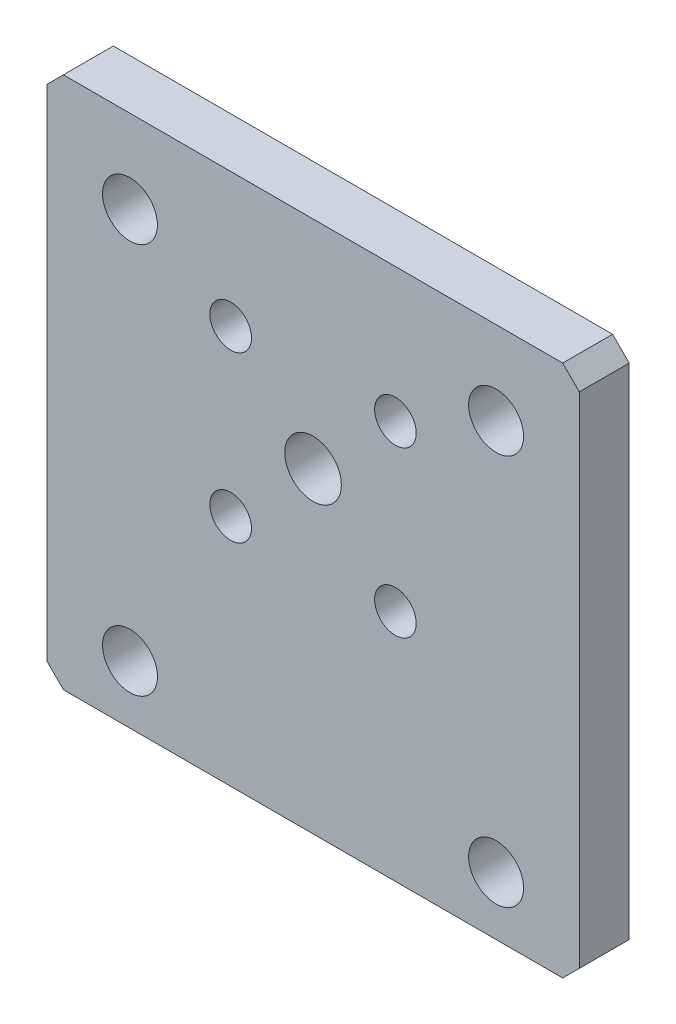
ISO-10303-21;
HEADER;
FILE_DESCRIPTION(('STEP AP214'),'2;1');
FILE_NAME('part.step','',(''),(''),'','','');
FILE_SCHEMA(('AUTOMOTIVE_DESIGN { 1 0 10303 214 1 1 1 1 }'));
ENDSEC;
DATA;
#1=APPLICATION_CONTEXT('core data for automotive mechanical design processes');
#2=APPLICATION_PROTOCOL_DEFINITION('international standard','automotive_design',2000,#1);
#3=PRODUCT_CONTEXT('',#1,'mechanical');
#4=PRODUCT('Part','Part','',(#3));
#5=PRODUCT_RELATED_PRODUCT_CATEGORY('part','',(#4));
#6=PRODUCT_DEFINITION_FORMATION('','',#4);
#7=PRODUCT_DEFINITION_CONTEXT('part definition',#1,'design');
#8=PRODUCT_DEFINITION('design','',#6,#7);
#9=PRODUCT_DEFINITION_SHAPE('','',#8);
#10=(LENGTH_UNIT() NAMED_UNIT(*) SI_UNIT(.MILLI.,.METRE.));
#11=(NAMED_UNIT(*) PLANE_ANGLE_UNIT() SI_UNIT($,.RADIAN.));
#12=(NAMED_UNIT(*) SI_UNIT($,.STERADIAN.) SOLID_ANGLE_UNIT());
#13=UNCERTAINTY_MEASURE_WITH_UNIT(LENGTH_MEASURE(1.E-05),#10,'distance_accuracy_value','');
#14=(GEOMETRIC_REPRESENTATION_CONTEXT(3) GLOBAL_UNCERTAINTY_ASSIGNED_CONTEXT((#13)) GLOBAL_UNIT_ASSIGNED_CONTEXT((#10,
#11,#12)) REPRESENTATION_CONTEXT('',''));
#15=CARTESIAN_POINT('',(0.,0.,0.));
#16=DIRECTION('',(0.,0.,1.));
#17=DIRECTION('',(1.,0.,0.));
#18=AXIS2_PLACEMENT_3D('',#15,#16,#17);
#19=CARTESIAN_POINT('',(0.,0.,3.));
#20=DIRECTION('',(0.,0.,-1.));
#21=DIRECTION('',(-1.,0.,0.));
#22=AXIS2_PLACEMENT_3D('',#19,#20,#21);
#23=PLANE('',#22);
#24=CARTESIAN_POINT('',(11.,8.,3.));
#25=DIRECTION('',(0.,0.,1.));
#26=DIRECTION('',(1.,0.,0.));
#27=AXIS2_PLACEMENT_3D('',#24,#25,#26);
#28=CIRCLE('',#27,1.64999999999999);
#29=CARTESIAN_POINT('',(12.65,8.,3.));
#30=VERTEX_POINT('',#29);
#31=EDGE_CURVE('E225',#30,#30,#28,.T.);
#32=ORIENTED_EDGE('',*,*,#31,.F.);
#33=EDGE_LOOP('',(#32));
#34=FACE_BOUND('',#33,.T.);
#35=CARTESIAN_POINT('',(11.,-15.5,3.));
#36=DIRECTION('',(0.,0.,1.));
#37=DIRECTION('',(1.,0.,0.));
#38=AXIS2_PLACEMENT_3D('',#35,#36,#37);
#39=CIRCLE('',#38,1.64999999999999);
#40=CARTESIAN_POINT('',(12.65,-15.5,3.));
#41=VERTEX_POINT('',#40);
#42=EDGE_CURVE('E213',#41,#41,#39,.T.);
#43=ORIENTED_EDGE('',*,*,#42,.F.);
#44=EDGE_LOOP('',(#43));
#45=FACE_BOUND('',#44,.T.);
#46=CARTESIAN_POINT('',(-4.94974746830586,4.94974746830581,3.));
#47=DIRECTION('',(0.,0.,1.));
#48=DIRECTION('',(1.,0.,0.));
#49=AXIS2_PLACEMENT_3D('',#46,#47,#48);
#50=CIRCLE('',#49,1.25);
#51=CARTESIAN_POINT('',(-3.69974746830586,4.94974746830581,3.));
#52=VERTEX_POINT('',#51);
#53=EDGE_CURVE('E155',#52,#52,#50,.T.);
#54=ORIENTED_EDGE('',*,*,#53,.F.);
#55=EDGE_LOOP('',(#54));
#56=FACE_BOUND('',#55,.T.);
#57=CARTESIAN_POINT('',(4.94974746830586,4.94974746830581,3.));
#58=DIRECTION('',(0.,0.,1.));
#59=DIRECTION('',(1.,0.,0.));
#60=AXIS2_PLACEMENT_3D('',#57,#58,#59);
#61=CIRCLE('',#60,1.25);
#62=CARTESIAN_POINT('',(6.19974746830586,4.94974746830581,3.));
#63=VERTEX_POINT('',#62);
#64=EDGE_CURVE('E154',#63,#63,#61,.T.);
#65=ORIENTED_EDGE('',*,*,#64,.F.);
#66=EDGE_LOOP('',(#65));
#67=FACE_BOUND('',#66,.T.);
#68=CARTESIAN_POINT('',(4.94974746830582,-4.94974746830584,3.));
#69=DIRECTION('',(0.,0.,1.));
#70=DIRECTION('',(1.,0.,0.));
#71=AXIS2_PLACEMENT_3D('',#68,#69,#70);
#72=CIRCLE('',#71,1.25);
#73=CARTESIAN_POINT('',(6.19974746830582,-4.94974746830584,3.));
#74=VERTEX_POINT('',#73);
#75=EDGE_CURVE('E150',#74,#74,#72,.T.);
#76=ORIENTED_EDGE('',*,*,#75,.F.);
#77=EDGE_LOOP('',(#76));
#78=FACE_BOUND('',#77,.T.);
#79=CARTESIAN_POINT('',(-4.94974746830586,-4.94974746830581,3.));
#80=DIRECTION('',(0.,0.,1.));
#81=DIRECTION('',(1.,0.,0.));
#82=AXIS2_PLACEMENT_3D('',#79,#80,#81);
#83=CIRCLE('',#82,1.25);
#84=CARTESIAN_POINT('',(-3.69974746830586,-4.94974746830581,3.));
#85=VERTEX_POINT('',#84);
#86=EDGE_CURVE('E146',#85,#85,#83,.T.);
#87=ORIENTED_EDGE('',*,*,#86,.F.);
#88=EDGE_LOOP('',(#87));
#89=FACE_BOUND('',#88,.T.);
#90=CARTESIAN_POINT('',(0.,0.,3.));
#91=DIRECTION('',(0.,0.,1.));
#92=DIRECTION('',(1.,0.,0.));
#93=AXIS2_PLACEMENT_3D('',#90,#91,#92);
#94=CIRCLE('',#93,1.7);
#95=CARTESIAN_POINT('',(1.7,0.,3.));
#96=VERTEX_POINT('',#95);
#97=EDGE_CURVE('E145',#96,#96,#94,.T.);
#98=ORIENTED_EDGE('',*,*,#97,.F.);
#99=EDGE_LOOP('',(#98));
#100=FACE_BOUND('',#99,.T.);
#101=DIRECTION('',(0.,-1.,0.));
#102=VECTOR('',#101,1.);
#103=CARTESIAN_POINT('',(-16.,13.,3.));
#104=LINE('',#103,#102);
#105=CARTESIAN_POINT('',(-16.,12.,3.));
#106=VERTEX_POINT('',#105);
#107=CARTESIAN_POINT('',(-16.,-17.9999999999999,3.));
#108=VERTEX_POINT('',#107);
#109=EDGE_CURVE('E141',#106,#108,#104,.T.);
#110=ORIENTED_EDGE('',*,*,#109,.T.);
#111=DIRECTION('',(-0.707106781186545,0.70710678118655,0.));
#112=VECTOR('',#111,1.);
#113=CARTESIAN_POINT('',(-15.,-19.,3.));
#114=LINE('',#113,#112);
#115=CARTESIAN_POINT('',(-15.,-19.,3.));
#116=VERTEX_POINT('',#115);
#117=EDGE_CURVE('E170',#108,#116,#114,.F.);
#118=ORIENTED_EDGE('',*,*,#117,.T.);
#119=DIRECTION('',(1.,0.,0.));
#120=VECTOR('',#119,1.);
#121=CARTESIAN_POINT('',(16.,-19.,3.));
#122=LINE('',#121,#120);
#123=CARTESIAN_POINT('',(15.,-19.,3.));
#124=VERTEX_POINT('',#123);
#125=EDGE_CURVE('E124',#116,#124,#122,.T.);
#126=ORIENTED_EDGE('',*,*,#125,.T.);
#127=DIRECTION('',(-0.707106781186548,-0.707106781186548,0.));
#128=VECTOR('',#127,1.);
#129=CARTESIAN_POINT('',(16.,-18.,3.));
#130=LINE('',#129,#128);
#131=CARTESIAN_POINT('',(16.,-18.,3.));
#132=VERTEX_POINT('',#131);
#133=EDGE_CURVE('E168',#124,#132,#130,.F.);
#134=ORIENTED_EDGE('',*,*,#133,.T.);
#135=DIRECTION('',(0.,1.,0.));
#136=VECTOR('',#135,1.);
#137=CARTESIAN_POINT('',(16.,13.,3.));
#138=LINE('',#137,#136);
#139=CARTESIAN_POINT('',(16.,12.,3.));
#140=VERTEX_POINT('',#139);
#141=EDGE_CURVE('E181',#132,#140,#138,.T.);
#142=ORIENTED_EDGE('',*,*,#141,.T.);
#143=DIRECTION('',(0.707106781186548,-0.707106781186548,0.));
#144=VECTOR('',#143,1.);
#145=CARTESIAN_POINT('',(15.,13.,3.));
#146=LINE('',#145,#144);
#147=CARTESIAN_POINT('',(15.,13.,3.));
#148=VERTEX_POINT('',#147);
#149=EDGE_CURVE('E59',#140,#148,#146,.F.);
#150=ORIENTED_EDGE('',*,*,#149,.T.);
#151=DIRECTION('',(-1.,0.,0.));
#152=VECTOR('',#151,1.);
#153=CARTESIAN_POINT('',(16.,13.,3.));
#154=LINE('',#153,#152);
#155=CARTESIAN_POINT('',(-15.,13.,3.));
#156=VERTEX_POINT('',#155);
#157=EDGE_CURVE('E156',#148,#156,#154,.T.);
#158=ORIENTED_EDGE('',*,*,#157,.T.);
#159=DIRECTION('',(0.70710678118655,0.707106781186545,0.));
#160=VECTOR('',#159,1.);
#161=CARTESIAN_POINT('',(-16.,12.,3.));
#162=LINE('',#161,#160);
#163=EDGE_CURVE('E165',#156,#106,#162,.F.);
#164=ORIENTED_EDGE('',*,*,#163,.T.);
#165=EDGE_LOOP('',(#110,#118,#126,#134,#142,#150,#158,#164));
#166=FACE_BOUND('',#165,.T.);
#167=CARTESIAN_POINT('',(-11.,-15.5,3.));
#168=DIRECTION('',(0.,0.,1.));
#169=DIRECTION('',(1.,0.,0.));
#170=AXIS2_PLACEMENT_3D('',#167,#168,#169);
#171=CIRCLE('',#170,1.64999999999999);
#172=CARTESIAN_POINT('',(-9.35000000000001,-15.5,3.));
#173=VERTEX_POINT('',#172);
#174=EDGE_CURVE('E219',#173,#173,#171,.T.);
#175=ORIENTED_EDGE('',*,*,#174,.F.);
#176=EDGE_LOOP('',(#175));
#177=FACE_BOUND('',#176,.T.);
#178=CARTESIAN_POINT('',(-11.,8.,3.));
#179=DIRECTION('',(0.,0.,1.));
#180=DIRECTION('',(1.,0.,0.));
#181=AXIS2_PLACEMENT_3D('',#178,#179,#180);
#182=CIRCLE('',#181,1.64999999999999);
#183=CARTESIAN_POINT('',(-9.35000000000001,8.,3.));
#184=VERTEX_POINT('',#183);
#185=EDGE_CURVE('E231',#184,#184,#182,.T.);
#186=ORIENTED_EDGE('',*,*,#185,.F.);
#187=EDGE_LOOP('',(#186));
#188=FACE_BOUND('',#187,.T.);
#189=ADVANCED_FACE('F38',(#34,#45,#56,#67,#78,#89,#100,#166,#177,#188),#23,.F.);
#190=CARTESIAN_POINT('',(-16.,13.,3.));
#191=DIRECTION('',(1.,0.,0.));
#192=DIRECTION('',(0.,1.,0.));
#193=AXIS2_PLACEMENT_3D('',#190,#191,#192);
#194=PLANE('',#193);
#195=DIRECTION('',(0.,-1.,0.));
#196=VECTOR('',#195,1.);
#197=CARTESIAN_POINT('',(-16.,13.,0.));
#198=LINE('',#197,#196);
#199=CARTESIAN_POINT('',(-16.,12.,0.));
#200=VERTEX_POINT('',#199);
#201=CARTESIAN_POINT('',(-16.,-17.9999999999999,0.));
#202=VERTEX_POINT('',#201);
#203=EDGE_CURVE('E131',#200,#202,#198,.T.);
#204=ORIENTED_EDGE('',*,*,#203,.T.);
#205=DIRECTION('',(0.,0.,1.));
#206=VECTOR('',#205,1.);
#207=CARTESIAN_POINT('',(-16.,-17.9999999999999,3.));
#208=LINE('',#207,#206);
#209=EDGE_CURVE('E109',#202,#108,#208,.T.);
#210=ORIENTED_EDGE('',*,*,#209,.T.);
#211=ORIENTED_EDGE('',*,*,#109,.F.);
#212=DIRECTION('',(0.,0.,-1.));
#213=VECTOR('',#212,1.);
#214=CARTESIAN_POINT('',(-16.,12.,3.));
#215=LINE('',#214,#213);
#216=EDGE_CURVE('E114',#106,#200,#215,.T.);
#217=ORIENTED_EDGE('',*,*,#216,.T.);
#218=EDGE_LOOP('',(#204,#210,#211,#217));
#219=FACE_BOUND('',#218,.T.);
#220=ADVANCED_FACE('F239',(#219),#194,.F.);
#221=CARTESIAN_POINT('',(16.,-19.,3.));
#222=DIRECTION('',(0.,1.,0.));
#223=DIRECTION('',(-1.,0.,0.));
#224=AXIS2_PLACEMENT_3D('',#221,#222,#223);
#225=PLANE('',#224);
#226=ORIENTED_EDGE('',*,*,#125,.F.);
#227=DIRECTION('',(0.,0.,-1.));
#228=VECTOR('',#227,1.);
#229=CARTESIAN_POINT('',(-15.,-19.,3.));
#230=LINE('',#229,#228);
#231=CARTESIAN_POINT('',(-15.,-19.,0.));
#232=VERTEX_POINT('',#231);
#233=EDGE_CURVE('E108',#116,#232,#230,.T.);
#234=ORIENTED_EDGE('',*,*,#233,.T.);
#235=DIRECTION('',(1.,0.,0.));
#236=VECTOR('',#235,1.);
#237=CARTESIAN_POINT('',(16.,-19.,0.));
#238=LINE('',#237,#236);
#239=CARTESIAN_POINT('',(15.,-19.,0.));
#240=VERTEX_POINT('',#239);
#241=EDGE_CURVE('E121',#232,#240,#238,.T.);
#242=ORIENTED_EDGE('',*,*,#241,.T.);
#243=DIRECTION('',(0.,0.,1.));
#244=VECTOR('',#243,1.);
#245=CARTESIAN_POINT('',(15.,-19.,3.));
#246=LINE('',#245,#244);
#247=EDGE_CURVE('E126',#240,#124,#246,.T.);
#248=ORIENTED_EDGE('',*,*,#247,.T.);
#249=EDGE_LOOP('',(#226,#234,#242,#248));
#250=FACE_BOUND('',#249,.T.);
#251=ADVANCED_FACE('F120',(#250),#225,.F.);
#252=CARTESIAN_POINT('',(16.,13.,3.));
#253=DIRECTION('',(-1.,0.,0.));
#254=DIRECTION('',(0.,-1.,0.));
#255=AXIS2_PLACEMENT_3D('',#252,#253,#254);
#256=PLANE('',#255);
#257=ORIENTED_EDGE('',*,*,#141,.F.);
#258=DIRECTION('',(0.,0.,-1.));
#259=VECTOR('',#258,1.);
#260=CARTESIAN_POINT('',(16.,-18.,3.));
#261=LINE('',#260,#259);
#262=CARTESIAN_POINT('',(16.,-18.,0.));
#263=VERTEX_POINT('',#262);
#264=EDGE_CURVE('E174',#132,#263,#261,.T.);
#265=ORIENTED_EDGE('',*,*,#264,.T.);
#266=DIRECTION('',(0.,1.,0.));
#267=VECTOR('',#266,1.);
#268=CARTESIAN_POINT('',(16.,13.,0.));
#269=LINE('',#268,#267);
#270=CARTESIAN_POINT('',(16.,12.,0.));
#271=VERTEX_POINT('',#270);
#272=EDGE_CURVE('E130',#263,#271,#269,.T.);
#273=ORIENTED_EDGE('',*,*,#272,.T.);
#274=DIRECTION('',(0.,0.,1.));
#275=VECTOR('',#274,1.);
#276=CARTESIAN_POINT('',(16.,12.,3.));
#277=LINE('',#276,#275);
#278=EDGE_CURVE('E172',#271,#140,#277,.T.);
#279=ORIENTED_EDGE('',*,*,#278,.T.);
#280=EDGE_LOOP('',(#257,#265,#273,#279));
#281=FACE_BOUND('',#280,.T.);
#282=ADVANCED_FACE('F179',(#281),#256,.F.);
#283=CARTESIAN_POINT('',(16.,13.,3.));
#284=DIRECTION('',(0.,-1.,0.));
#285=DIRECTION('',(1.,0.,0.));
#286=AXIS2_PLACEMENT_3D('',#283,#284,#285);
#287=PLANE('',#286);
#288=ORIENTED_EDGE('',*,*,#157,.F.);
#289=DIRECTION('',(0.,0.,-1.));
#290=VECTOR('',#289,1.);
#291=CARTESIAN_POINT('',(15.,13.,3.));
#292=LINE('',#291,#290);
#293=CARTESIAN_POINT('',(15.,13.,0.));
#294=VERTEX_POINT('',#293);
#295=EDGE_CURVE('E11',#148,#294,#292,.T.);
#296=ORIENTED_EDGE('',*,*,#295,.T.);
#297=DIRECTION('',(-1.,0.,0.));
#298=VECTOR('',#297,1.);
#299=CARTESIAN_POINT('',(16.,13.,0.));
#300=LINE('',#299,#298);
#301=CARTESIAN_POINT('',(-15.,13.,0.));
#302=VERTEX_POINT('',#301);
#303=EDGE_CURVE('E134',#294,#302,#300,.T.);
#304=ORIENTED_EDGE('',*,*,#303,.T.);
#305=DIRECTION('',(0.,0.,1.));
#306=VECTOR('',#305,1.);
#307=CARTESIAN_POINT('',(-15.,13.,3.));
#308=LINE('',#307,#306);
#309=EDGE_CURVE('E46',#302,#156,#308,.T.);
#310=ORIENTED_EDGE('',*,*,#309,.T.);
#311=EDGE_LOOP('',(#288,#296,#304,#310));
#312=FACE_BOUND('',#311,.T.);
#313=ADVANCED_FACE('F188',(#312),#287,.F.);
#314=CARTESIAN_POINT('',(0.,0.,0.));
#315=DIRECTION('',(0.,0.,-1.));
#316=DIRECTION('',(-1.,0.,0.));
#317=AXIS2_PLACEMENT_3D('',#314,#315,#316);
#318=PLANE('',#317);
#319=CARTESIAN_POINT('',(-11.,8.,0.));
#320=DIRECTION('',(0.,0.,-1.));
#321=DIRECTION('',(-1.,0.,0.));
#322=AXIS2_PLACEMENT_3D('',#319,#320,#321);
#323=CIRCLE('',#322,1.64999999999999);
#324=CARTESIAN_POINT('',(-12.65,8.,0.));
#325=VERTEX_POINT('',#324);
#326=EDGE_CURVE('E228',#325,#325,#323,.T.);
#327=ORIENTED_EDGE('',*,*,#326,.F.);
#328=EDGE_LOOP('',(#327));
#329=FACE_BOUND('',#328,.T.);
#330=CARTESIAN_POINT('',(11.,8.,0.));
#331=DIRECTION('',(0.,0.,-1.));
#332=DIRECTION('',(-1.,0.,0.));
#333=AXIS2_PLACEMENT_3D('',#330,#331,#332);
#334=CIRCLE('',#333,1.64999999999999);
#335=CARTESIAN_POINT('',(9.35000000000001,8.,0.));
#336=VERTEX_POINT('',#335);
#337=EDGE_CURVE('E222',#336,#336,#334,.T.);
#338=ORIENTED_EDGE('',*,*,#337,.F.);
#339=EDGE_LOOP('',(#338));
#340=FACE_BOUND('',#339,.T.);
#341=CARTESIAN_POINT('',(-11.,-15.5,0.));
#342=DIRECTION('',(0.,0.,-1.));
#343=DIRECTION('',(-1.,0.,0.));
#344=AXIS2_PLACEMENT_3D('',#341,#342,#343);
#345=CIRCLE('',#344,1.64999999999999);
#346=CARTESIAN_POINT('',(-12.65,-15.5,0.));
#347=VERTEX_POINT('',#346);
#348=EDGE_CURVE('E216',#347,#347,#345,.T.);
#349=ORIENTED_EDGE('',*,*,#348,.F.);
#350=EDGE_LOOP('',(#349));
#351=FACE_BOUND('',#350,.T.);
#352=CARTESIAN_POINT('',(11.,-15.5,0.));
#353=DIRECTION('',(0.,0.,-1.));
#354=DIRECTION('',(-1.,0.,0.));
#355=AXIS2_PLACEMENT_3D('',#352,#353,#354);
#356=CIRCLE('',#355,1.64999999999999);
#357=CARTESIAN_POINT('',(9.35000000000001,-15.5,0.));
#358=VERTEX_POINT('',#357);
#359=EDGE_CURVE('E210',#358,#358,#356,.T.);
#360=ORIENTED_EDGE('',*,*,#359,.F.);
#361=EDGE_LOOP('',(#360));
#362=FACE_BOUND('',#361,.T.);
#363=CARTESIAN_POINT('',(-4.94974746830586,4.94974746830581,0.));
#364=DIRECTION('',(0.,0.,-1.));
#365=DIRECTION('',(-1.,0.,0.));
#366=AXIS2_PLACEMENT_3D('',#363,#364,#365);
#367=CIRCLE('',#366,1.25);
#368=CARTESIAN_POINT('',(-6.19974746830586,4.94974746830581,0.));
#369=VERTEX_POINT('',#368);
#370=EDGE_CURVE('E151',#369,#369,#367,.T.);
#371=ORIENTED_EDGE('',*,*,#370,.F.);
#372=EDGE_LOOP('',(#371));
#373=FACE_BOUND('',#372,.T.);
#374=CARTESIAN_POINT('',(4.94974746830586,4.94974746830581,0.));
#375=DIRECTION('',(0.,0.,-1.));
#376=DIRECTION('',(-1.,0.,0.));
#377=AXIS2_PLACEMENT_3D('',#374,#375,#376);
#378=CIRCLE('',#377,1.25);
#379=CARTESIAN_POINT('',(3.69974746830586,4.94974746830581,0.));
#380=VERTEX_POINT('',#379);
#381=EDGE_CURVE('E203',#380,#380,#378,.T.);
#382=ORIENTED_EDGE('',*,*,#381,.F.);
#383=EDGE_LOOP('',(#382));
#384=FACE_BOUND('',#383,.T.);
#385=CARTESIAN_POINT('',(4.94974746830582,-4.94974746830584,0.));
#386=DIRECTION('',(0.,0.,-1.));
#387=DIRECTION('',(-1.,0.,0.));
#388=AXIS2_PLACEMENT_3D('',#385,#386,#387);
#389=CIRCLE('',#388,1.25);
#390=CARTESIAN_POINT('',(3.69974746830583,-4.94974746830584,0.));
#391=VERTEX_POINT('',#390);
#392=EDGE_CURVE('E147',#391,#391,#389,.T.);
#393=ORIENTED_EDGE('',*,*,#392,.F.);
#394=EDGE_LOOP('',(#393));
#395=FACE_BOUND('',#394,.T.);
#396=CARTESIAN_POINT('',(-4.94974746830586,-4.94974746830581,0.));
#397=DIRECTION('',(0.,0.,-1.));
#398=DIRECTION('',(-1.,0.,0.));
#399=AXIS2_PLACEMENT_3D('',#396,#397,#398);
#400=CIRCLE('',#399,1.25);
#401=CARTESIAN_POINT('',(-6.19974746830586,-4.94974746830581,0.));
#402=VERTEX_POINT('',#401);
#403=EDGE_CURVE('E142',#402,#402,#400,.T.);
#404=ORIENTED_EDGE('',*,*,#403,.F.);
#405=EDGE_LOOP('',(#404));
#406=FACE_BOUND('',#405,.T.);
#407=CARTESIAN_POINT('',(0.,0.,0.));
#408=DIRECTION('',(0.,0.,-1.));
#409=DIRECTION('',(-1.,0.,0.));
#410=AXIS2_PLACEMENT_3D('',#407,#408,#409);
#411=CIRCLE('',#410,1.7);
#412=CARTESIAN_POINT('',(-1.7,0.,0.));
#413=VERTEX_POINT('',#412);
#414=EDGE_CURVE('E136',#413,#413,#411,.T.);
#415=ORIENTED_EDGE('',*,*,#414,.F.);
#416=EDGE_LOOP('',(#415));
#417=FACE_BOUND('',#416,.T.);
#418=ORIENTED_EDGE('',*,*,#241,.F.);
#419=DIRECTION('',(0.707106781186545,-0.70710678118655,0.));
#420=VECTOR('',#419,1.);
#421=CARTESIAN_POINT('',(-17.,-16.9999999999999,0.));
#422=LINE('',#421,#420);
#423=EDGE_CURVE('E104',#232,#202,#422,.F.);
#424=ORIENTED_EDGE('',*,*,#423,.T.);
#425=ORIENTED_EDGE('',*,*,#203,.F.);
#426=DIRECTION('',(-0.70710678118655,-0.707106781186545,0.));
#427=VECTOR('',#426,1.);
#428=CARTESIAN_POINT('',(-13.9999999999999,14.,0.));
#429=LINE('',#428,#427);
#430=EDGE_CURVE('E125',#200,#302,#429,.F.);
#431=ORIENTED_EDGE('',*,*,#430,.T.);
#432=ORIENTED_EDGE('',*,*,#303,.F.);
#433=DIRECTION('',(-0.707106781186548,0.707106781186548,0.));
#434=VECTOR('',#433,1.);
#435=CARTESIAN_POINT('',(14.,14.,0.));
#436=LINE('',#435,#434);
#437=EDGE_CURVE('E159',#294,#271,#436,.F.);
#438=ORIENTED_EDGE('',*,*,#437,.T.);
#439=ORIENTED_EDGE('',*,*,#272,.F.);
#440=DIRECTION('',(0.707106781186548,0.707106781186548,0.));
#441=VECTOR('',#440,1.);
#442=CARTESIAN_POINT('',(17.,-17.,0.));
#443=LINE('',#442,#441);
#444=EDGE_CURVE('E115',#263,#240,#443,.F.);
#445=ORIENTED_EDGE('',*,*,#444,.T.);
#446=EDGE_LOOP('',(#418,#424,#425,#431,#432,#438,#439,#445));
#447=FACE_BOUND('',#446,.T.);
#448=ADVANCED_FACE('F128',(#329,#340,#351,#362,#373,#384,#395,#406,#417,#447),#318,.T.);
#449=CARTESIAN_POINT('',(0.,0.,3.));
#450=DIRECTION('',(0.,0.,1.));
#451=DIRECTION('',(1.,0.,0.));
#452=AXIS2_PLACEMENT_3D('',#449,#450,#451);
#453=CYLINDRICAL_SURFACE('',#452,1.7);
#454=ORIENTED_EDGE('',*,*,#414,.T.);
#455=EDGE_LOOP('',(#454));
#456=FACE_BOUND('',#455,.T.);
#457=ORIENTED_EDGE('',*,*,#97,.T.);
#458=EDGE_LOOP('',(#457));
#459=FACE_BOUND('',#458,.T.);
#460=ADVANCED_FACE('F251',(#456,#459),#453,.F.);
#461=CARTESIAN_POINT('',(-4.94974746830586,-4.94974746830581,3.));
#462=DIRECTION('',(0.,0.,1.));
#463=DIRECTION('',(1.,0.,0.));
#464=AXIS2_PLACEMENT_3D('',#461,#462,#463);
#465=CYLINDRICAL_SURFACE('',#464,1.25);
#466=ORIENTED_EDGE('',*,*,#403,.T.);
#467=EDGE_LOOP('',(#466));
#468=FACE_BOUND('',#467,.T.);
#469=ORIENTED_EDGE('',*,*,#86,.T.);
#470=EDGE_LOOP('',(#469));
#471=FACE_BOUND('',#470,.T.);
#472=ADVANCED_FACE('F301',(#468,#471),#465,.F.);
#473=CARTESIAN_POINT('',(4.94974746830582,-4.94974746830584,3.));
#474=DIRECTION('',(0.,0.,1.));
#475=DIRECTION('',(1.,0.,0.));
#476=AXIS2_PLACEMENT_3D('',#473,#474,#475);
#477=CYLINDRICAL_SURFACE('',#476,1.25);
#478=ORIENTED_EDGE('',*,*,#392,.T.);
#479=EDGE_LOOP('',(#478));
#480=FACE_BOUND('',#479,.T.);
#481=ORIENTED_EDGE('',*,*,#75,.T.);
#482=EDGE_LOOP('',(#481));
#483=FACE_BOUND('',#482,.T.);
#484=ADVANCED_FACE('F307',(#480,#483),#477,.F.);
#485=CARTESIAN_POINT('',(4.94974746830586,4.94974746830581,3.));
#486=DIRECTION('',(0.,0.,1.));
#487=DIRECTION('',(1.,0.,0.));
#488=AXIS2_PLACEMENT_3D('',#485,#486,#487);
#489=CYLINDRICAL_SURFACE('',#488,1.25);
#490=ORIENTED_EDGE('',*,*,#381,.T.);
#491=EDGE_LOOP('',(#490));
#492=FACE_BOUND('',#491,.T.);
#493=ORIENTED_EDGE('',*,*,#64,.T.);
#494=EDGE_LOOP('',(#493));
#495=FACE_BOUND('',#494,.T.);
#496=ADVANCED_FACE('F312',(#492,#495),#489,.F.);
#497=CARTESIAN_POINT('',(-4.94974746830586,4.94974746830581,3.));
#498=DIRECTION('',(0.,0.,1.));
#499=DIRECTION('',(1.,0.,0.));
#500=AXIS2_PLACEMENT_3D('',#497,#498,#499);
#501=CYLINDRICAL_SURFACE('',#500,1.25);
#502=ORIENTED_EDGE('',*,*,#370,.T.);
#503=EDGE_LOOP('',(#502));
#504=FACE_BOUND('',#503,.T.);
#505=ORIENTED_EDGE('',*,*,#53,.T.);
#506=EDGE_LOOP('',(#505));
#507=FACE_BOUND('',#506,.T.);
#508=ADVANCED_FACE('F319',(#504,#507),#501,.F.);
#509=CARTESIAN_POINT('',(11.,-15.5,3.));
#510=DIRECTION('',(0.,0.,1.));
#511=DIRECTION('',(1.,0.,0.));
#512=AXIS2_PLACEMENT_3D('',#509,#510,#511);
#513=CYLINDRICAL_SURFACE('',#512,1.64999999999999);
#514=ORIENTED_EDGE('',*,*,#42,.T.);
#515=EDGE_LOOP('',(#514));
#516=FACE_BOUND('',#515,.T.);
#517=ORIENTED_EDGE('',*,*,#359,.T.);
#518=EDGE_LOOP('',(#517));
#519=FACE_BOUND('',#518,.T.);
#520=ADVANCED_FACE('F282',(#516,#519),#513,.F.);
#521=CARTESIAN_POINT('',(-11.,-15.5,3.));
#522=DIRECTION('',(0.,0.,1.));
#523=DIRECTION('',(1.,0.,0.));
#524=AXIS2_PLACEMENT_3D('',#521,#522,#523);
#525=CYLINDRICAL_SURFACE('',#524,1.64999999999999);
#526=ORIENTED_EDGE('',*,*,#174,.T.);
#527=EDGE_LOOP('',(#526));
#528=FACE_BOUND('',#527,.T.);
#529=ORIENTED_EDGE('',*,*,#348,.T.);
#530=EDGE_LOOP('',(#529));
#531=FACE_BOUND('',#530,.T.);
#532=ADVANCED_FACE('F278',(#528,#531),#525,.F.);
#533=CARTESIAN_POINT('',(11.,8.,3.));
#534=DIRECTION('',(0.,0.,1.));
#535=DIRECTION('',(1.,0.,0.));
#536=AXIS2_PLACEMENT_3D('',#533,#534,#535);
#537=CYLINDRICAL_SURFACE('',#536,1.64999999999999);
#538=ORIENTED_EDGE('',*,*,#31,.T.);
#539=EDGE_LOOP('',(#538));
#540=FACE_BOUND('',#539,.T.);
#541=ORIENTED_EDGE('',*,*,#337,.T.);
#542=EDGE_LOOP('',(#541));
#543=FACE_BOUND('',#542,.T.);
#544=ADVANCED_FACE('F281',(#540,#543),#537,.F.);
#545=CARTESIAN_POINT('',(-11.,8.,3.));
#546=DIRECTION('',(0.,0.,1.));
#547=DIRECTION('',(1.,0.,0.));
#548=AXIS2_PLACEMENT_3D('',#545,#546,#547);
#549=CYLINDRICAL_SURFACE('',#548,1.64999999999999);
#550=ORIENTED_EDGE('',*,*,#185,.T.);
#551=EDGE_LOOP('',(#550));
#552=FACE_BOUND('',#551,.T.);
#553=ORIENTED_EDGE('',*,*,#326,.T.);
#554=EDGE_LOOP('',(#553));
#555=FACE_BOUND('',#554,.T.);
#556=ADVANCED_FACE('F235',(#552,#555),#549,.F.);
#557=CARTESIAN_POINT('',(-15.,-19.,3.));
#558=DIRECTION('',(0.70710678118655,0.707106781186545,0.));
#559=DIRECTION('',(0.,0.,-1.));
#560=AXIS2_PLACEMENT_3D('',#557,#558,#559);
#561=PLANE('',#560);
#562=ORIENTED_EDGE('',*,*,#117,.F.);
#563=ORIENTED_EDGE('',*,*,#209,.F.);
#564=ORIENTED_EDGE('',*,*,#423,.F.);
#565=ORIENTED_EDGE('',*,*,#233,.F.);
#566=EDGE_LOOP('',(#562,#563,#564,#565));
#567=FACE_BOUND('',#566,.T.);
#568=ADVANCED_FACE('F107',(#567),#561,.F.);
#569=CARTESIAN_POINT('',(16.,-18.,3.));
#570=DIRECTION('',(-0.707106781186547,0.707106781186547,0.));
#571=DIRECTION('',(0.,0.,-1.));
#572=AXIS2_PLACEMENT_3D('',#569,#570,#571);
#573=PLANE('',#572);
#574=ORIENTED_EDGE('',*,*,#133,.F.);
#575=ORIENTED_EDGE('',*,*,#247,.F.);
#576=ORIENTED_EDGE('',*,*,#444,.F.);
#577=ORIENTED_EDGE('',*,*,#264,.F.);
#578=EDGE_LOOP('',(#574,#575,#576,#577));
#579=FACE_BOUND('',#578,.T.);
#580=ADVANCED_FACE('F264',(#579),#573,.F.);
#581=CARTESIAN_POINT('',(15.,13.,3.));
#582=DIRECTION('',(-0.707106781186547,-0.707106781186547,0.));
#583=DIRECTION('',(0.,0.,-1.));
#584=AXIS2_PLACEMENT_3D('',#581,#582,#583);
#585=PLANE('',#584);
#586=ORIENTED_EDGE('',*,*,#149,.F.);
#587=ORIENTED_EDGE('',*,*,#278,.F.);
#588=ORIENTED_EDGE('',*,*,#437,.F.);
#589=ORIENTED_EDGE('',*,*,#295,.F.);
#590=EDGE_LOOP('',(#586,#587,#588,#589));
#591=FACE_BOUND('',#590,.T.);
#592=ADVANCED_FACE('F187',(#591),#585,.F.);
#593=CARTESIAN_POINT('',(-16.,12.,3.));
#594=DIRECTION('',(0.707106781186545,-0.70710678118655,0.));
#595=DIRECTION('',(0.,0.,-1.));
#596=AXIS2_PLACEMENT_3D('',#593,#594,#595);
#597=PLANE('',#596);
#598=ORIENTED_EDGE('',*,*,#163,.F.);
#599=ORIENTED_EDGE('',*,*,#309,.F.);
#600=ORIENTED_EDGE('',*,*,#430,.F.);
#601=ORIENTED_EDGE('',*,*,#216,.F.);
#602=EDGE_LOOP('',(#598,#599,#600,#601));
#603=FACE_BOUND('',#602,.T.);
#604=ADVANCED_FACE('F40',(#603),#597,.F.);
#605=CLOSED_SHELL('',(#189,#220,#251,#282,#313,#448,#460,#472,#484,#496,#508,#520,#532,#544,
#556,#568,#580,#592,#604));
#606=MANIFOLD_SOLID_BREP('B2',#605);
#607=ADVANCED_BREP_SHAPE_REPRESENTATION('',(#18,#606),#14);
#608=SHAPE_DEFINITION_REPRESENTATION(#9,#607);
ENDSEC;
END-ISO-10303-21;
